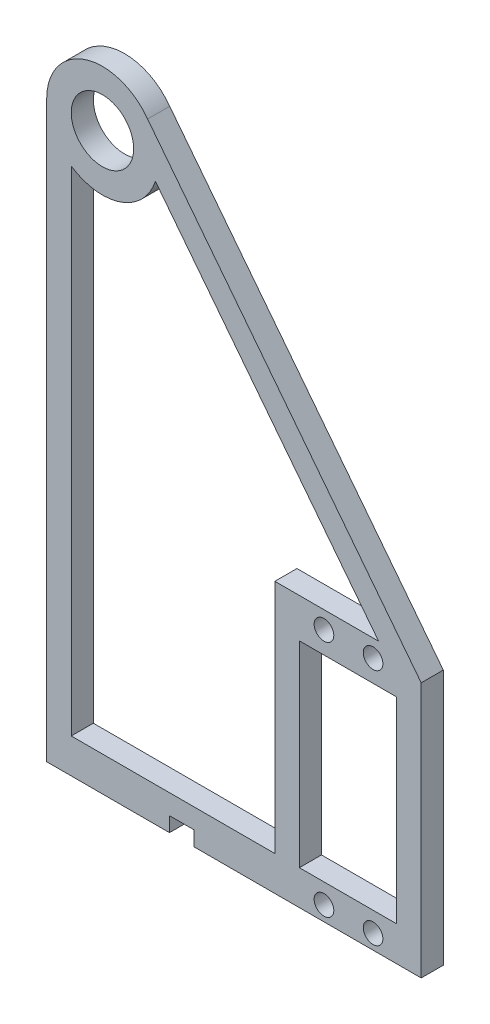
ISO-10303-21;
HEADER;
FILE_DESCRIPTION(('STEP AP214'),'2;1');
FILE_NAME('part.step','',(''),(''),'','','');
FILE_SCHEMA(('AUTOMOTIVE_DESIGN { 1 0 10303 214 1 1 1 1 }'));
ENDSEC;
DATA;
#1=APPLICATION_CONTEXT('core data for automotive mechanical design processes');
#2=APPLICATION_PROTOCOL_DEFINITION('international standard','automotive_design',2000,#1);
#3=PRODUCT_CONTEXT('',#1,'mechanical');
#4=PRODUCT('Part','Part','',(#3));
#5=PRODUCT_RELATED_PRODUCT_CATEGORY('part','',(#4));
#6=PRODUCT_DEFINITION_FORMATION('','',#4);
#7=PRODUCT_DEFINITION_CONTEXT('part definition',#1,'design');
#8=PRODUCT_DEFINITION('design','',#6,#7);
#9=PRODUCT_DEFINITION_SHAPE('','',#8);
#10=(LENGTH_UNIT() NAMED_UNIT(*) SI_UNIT(.MILLI.,.METRE.));
#11=(NAMED_UNIT(*) PLANE_ANGLE_UNIT() SI_UNIT($,.RADIAN.));
#12=(NAMED_UNIT(*) SI_UNIT($,.STERADIAN.) SOLID_ANGLE_UNIT());
#13=UNCERTAINTY_MEASURE_WITH_UNIT(LENGTH_MEASURE(1.E-05),#10,'distance_accuracy_value','');
#14=(GEOMETRIC_REPRESENTATION_CONTEXT(3) GLOBAL_UNCERTAINTY_ASSIGNED_CONTEXT((#13)) GLOBAL_UNIT_ASSIGNED_CONTEXT((#10,
#11,#12)) REPRESENTATION_CONTEXT('',''));
#15=CARTESIAN_POINT('',(0.,0.,0.));
#16=DIRECTION('',(0.,0.,1.));
#17=DIRECTION('',(1.,0.,0.));
#18=AXIS2_PLACEMENT_3D('',#15,#16,#17);
#19=CARTESIAN_POINT('',(0.,-116.95,4.5));
#20=DIRECTION('',(0.,1.,0.));
#21=DIRECTION('',(0.,0.,1.));
#22=AXIS2_PLACEMENT_3D('',#19,#20,#21);
#23=PLANE('',#22);
#24=DIRECTION('',(1.,0.,0.));
#25=VECTOR('',#24,1.);
#26=CARTESIAN_POINT('',(0.,-116.95,0.));
#27=LINE('',#26,#25);
#28=CARTESIAN_POINT('',(-11.35,-116.95,0.));
#29=VERTEX_POINT('',#28);
#30=CARTESIAN_POINT('',(13.65,-116.95,0.));
#31=VERTEX_POINT('',#30);
#32=EDGE_CURVE('E267',#29,#31,#27,.T.);
#33=ORIENTED_EDGE('',*,*,#32,.T.);
#34=DIRECTION('',(0.,0.,1.));
#35=VECTOR('',#34,1.);
#36=CARTESIAN_POINT('',(13.65,-116.95,0.));
#37=LINE('',#36,#35);
#38=CARTESIAN_POINT('',(13.65,-116.95,4.5));
#39=VERTEX_POINT('',#38);
#40=EDGE_CURVE('E203',#31,#39,#37,.T.);
#41=ORIENTED_EDGE('',*,*,#40,.T.);
#42=DIRECTION('',(1.,0.,0.));
#43=VECTOR('',#42,1.);
#44=CARTESIAN_POINT('',(0.,-116.95,4.5));
#45=LINE('',#44,#43);
#46=CARTESIAN_POINT('',(-11.35,-116.95,4.5));
#47=VERTEX_POINT('',#46);
#48=EDGE_CURVE('E182',#47,#39,#45,.T.);
#49=ORIENTED_EDGE('',*,*,#48,.F.);
#50=DIRECTION('',(0.,0.,-1.));
#51=VECTOR('',#50,1.);
#52=CARTESIAN_POINT('',(-11.35,-116.95,4.5));
#53=LINE('',#52,#51);
#54=EDGE_CURVE('E191',#47,#29,#53,.T.);
#55=ORIENTED_EDGE('',*,*,#54,.T.);
#56=EDGE_LOOP('',(#33,#41,#49,#55));
#57=FACE_BOUND('',#56,.T.);
#58=ADVANCED_FACE('F47',(#57),#23,.F.);
#59=CARTESIAN_POINT('',(8.95037531260461,6.96792282137096,4.5));
#60=DIRECTION('',(-0.789073583182352,-0.614298689827484,0.));
#61=DIRECTION('',(0.614298689827484,-0.789073583182352,0.));
#62=AXIS2_PLACEMENT_3D('',#59,#60,#61);
#63=PLANE('',#62);
#64=DIRECTION('',(-0.614298689827484,0.789073583182353,0.));
#65=VECTOR('',#64,1.);
#66=CARTESIAN_POINT('',(8.95037531260461,6.96792282137096,0.));
#67=LINE('',#66,#65);
#68=CARTESIAN_POINT('',(64.9,-64.9,0.));
#69=VERTEX_POINT('',#68);
#70=CARTESIAN_POINT('',(9.19711648453544,6.65098100808344,0.));
#71=VERTEX_POINT('',#70);
#72=EDGE_CURVE('E257',#69,#71,#67,.T.);
#73=ORIENTED_EDGE('',*,*,#72,.T.);
#74=DIRECTION('',(0.,0.,-1.));
#75=VECTOR('',#74,1.);
#76=CARTESIAN_POINT('',(9.19711648453544,6.65098100808344,4.5));
#77=LINE('',#76,#75);
#78=CARTESIAN_POINT('',(9.19711648453544,6.65098100808344,4.5));
#79=VERTEX_POINT('',#78);
#80=EDGE_CURVE('E11',#79,#71,#77,.T.);
#81=ORIENTED_EDGE('',*,*,#80,.F.);
#82=DIRECTION('',(-0.614298689827484,0.789073583182353,0.));
#83=VECTOR('',#82,1.);
#84=CARTESIAN_POINT('',(8.95037531260461,6.96792282137096,4.5));
#85=LINE('',#84,#83);
#86=CARTESIAN_POINT('',(64.9,-64.9,4.5));
#87=VERTEX_POINT('',#86);
#88=EDGE_CURVE('E371',#87,#79,#85,.T.);
#89=ORIENTED_EDGE('',*,*,#88,.F.);
#90=DIRECTION('',(0.,0.,-1.));
#91=VECTOR('',#90,1.);
#92=CARTESIAN_POINT('',(64.9,-64.9,4.5));
#93=LINE('',#92,#91);
#94=EDGE_CURVE('E273',#87,#69,#93,.T.);
#95=ORIENTED_EDGE('',*,*,#94,.T.);
#96=EDGE_LOOP('',(#73,#81,#89,#95));
#97=FACE_BOUND('',#96,.T.);
#98=ADVANCED_FACE('F377',(#97),#63,.F.);
#99=CARTESIAN_POINT('',(0.,0.,4.5));
#100=DIRECTION('',(0.,0.,-1.));
#101=DIRECTION('',(-1.,0.,0.));
#102=AXIS2_PLACEMENT_3D('',#99,#100,#101);
#103=CYLINDRICAL_SURFACE('',#102,11.35);
#104=CARTESIAN_POINT('',(0.,0.,0.));
#105=DIRECTION('',(0.,0.,1.));
#106=DIRECTION('',(1.,0.,0.));
#107=AXIS2_PLACEMENT_3D('',#104,#105,#106);
#108=CIRCLE('',#107,11.35);
#109=CARTESIAN_POINT('',(-11.35,0.,0.));
#110=VERTEX_POINT('',#109);
#111=EDGE_CURVE('E261',#71,#110,#108,.T.);
#112=ORIENTED_EDGE('',*,*,#111,.T.);
#113=DIRECTION('',(0.,0.,-1.));
#114=VECTOR('',#113,1.);
#115=CARTESIAN_POINT('',(-11.35,0.,4.5));
#116=LINE('',#115,#114);
#117=CARTESIAN_POINT('',(-11.35,0.,4.5));
#118=VERTEX_POINT('',#117);
#119=EDGE_CURVE('E57',#118,#110,#116,.T.);
#120=ORIENTED_EDGE('',*,*,#119,.F.);
#121=CARTESIAN_POINT('',(0.,0.,4.5));
#122=DIRECTION('',(0.,0.,1.));
#123=DIRECTION('',(1.,0.,0.));
#124=AXIS2_PLACEMENT_3D('',#121,#122,#123);
#125=CIRCLE('',#124,11.35);
#126=EDGE_CURVE('E183',#79,#118,#125,.T.);
#127=ORIENTED_EDGE('',*,*,#126,.F.);
#128=ORIENTED_EDGE('',*,*,#80,.T.);
#129=EDGE_LOOP('',(#112,#120,#127,#128));
#130=FACE_BOUND('',#129,.T.);
#131=ADVANCED_FACE('F380',(#130),#103,.T.);
#132=CARTESIAN_POINT('',(-11.35,0.,4.5));
#133=DIRECTION('',(1.,0.,0.));
#134=DIRECTION('',(0.,0.,-1.));
#135=AXIS2_PLACEMENT_3D('',#132,#133,#134);
#136=PLANE('',#135);
#137=DIRECTION('',(0.,-1.,0.));
#138=VECTOR('',#137,1.);
#139=CARTESIAN_POINT('',(-11.35,0.,0.));
#140=LINE('',#139,#138);
#141=EDGE_CURVE('E194',#110,#29,#140,.T.);
#142=ORIENTED_EDGE('',*,*,#141,.T.);
#143=ORIENTED_EDGE('',*,*,#54,.F.);
#144=DIRECTION('',(0.,-1.,0.));
#145=VECTOR('',#144,1.);
#146=CARTESIAN_POINT('',(-11.35,0.,4.5));
#147=LINE('',#146,#145);
#148=EDGE_CURVE('E175',#118,#47,#147,.T.);
#149=ORIENTED_EDGE('',*,*,#148,.F.);
#150=ORIENTED_EDGE('',*,*,#119,.T.);
#151=EDGE_LOOP('',(#142,#143,#149,#150));
#152=FACE_BOUND('',#151,.T.);
#153=ADVANCED_FACE('F192',(#152),#136,.F.);
#154=CARTESIAN_POINT('',(18.65,-116.95,4.5));
#155=VERTEX_POINT('',#154);
#156=CARTESIAN_POINT('',(64.9,-116.95,4.5));
#157=VERTEX_POINT('',#156);
#158=EDGE_CURVE('E188',#155,#157,#45,.T.);
#159=ORIENTED_EDGE('',*,*,#158,.F.);
#160=DIRECTION('',(0.,0.,1.));
#161=VECTOR('',#160,1.);
#162=CARTESIAN_POINT('',(18.65,-116.95,0.));
#163=LINE('',#162,#161);
#164=CARTESIAN_POINT('',(18.65,-116.95,0.));
#165=VERTEX_POINT('',#164);
#166=EDGE_CURVE('E409',#165,#155,#163,.T.);
#167=ORIENTED_EDGE('',*,*,#166,.F.);
#168=CARTESIAN_POINT('',(64.9,-116.95,0.));
#169=VERTEX_POINT('',#168);
#170=EDGE_CURVE('E266',#165,#169,#27,.T.);
#171=ORIENTED_EDGE('',*,*,#170,.T.);
#172=DIRECTION('',(0.,0.,-1.));
#173=VECTOR('',#172,1.);
#174=CARTESIAN_POINT('',(64.9,-116.95,4.5));
#175=LINE('',#174,#173);
#176=EDGE_CURVE('E199',#157,#169,#175,.T.);
#177=ORIENTED_EDGE('',*,*,#176,.F.);
#178=EDGE_LOOP('',(#159,#167,#171,#177));
#179=FACE_BOUND('',#178,.T.);
#180=ADVANCED_FACE('F487',(#179),#23,.F.);
#181=CARTESIAN_POINT('',(40.1,0.,4.5));
#182=DIRECTION('',(1.,0.,0.));
#183=DIRECTION('',(0.,1.,0.));
#184=AXIS2_PLACEMENT_3D('',#181,#182,#183);
#185=PLANE('',#184);
#186=DIRECTION('',(0.,-1.,0.));
#187=VECTOR('',#186,1.);
#188=CARTESIAN_POINT('',(40.1,0.,0.));
#189=LINE('',#188,#187);
#190=CARTESIAN_POINT('',(40.1,-69.9,0.));
#191=VERTEX_POINT('',#190);
#192=CARTESIAN_POINT('',(40.1,-109.9,0.));
#193=VERTEX_POINT('',#192);
#194=EDGE_CURVE('E237',#191,#193,#189,.T.);
#195=ORIENTED_EDGE('',*,*,#194,.F.);
#196=DIRECTION('',(0.,0.,-1.));
#197=VECTOR('',#196,1.);
#198=CARTESIAN_POINT('',(40.1,-69.9,4.5));
#199=LINE('',#198,#197);
#200=CARTESIAN_POINT('',(40.1,-69.9,4.5));
#201=VERTEX_POINT('',#200);
#202=EDGE_CURVE('E276',#201,#191,#199,.T.);
#203=ORIENTED_EDGE('',*,*,#202,.F.);
#204=DIRECTION('',(0.,-1.,0.));
#205=VECTOR('',#204,1.);
#206=CARTESIAN_POINT('',(40.1,0.,4.5));
#207=LINE('',#206,#205);
#208=CARTESIAN_POINT('',(40.1,-109.9,4.5));
#209=VERTEX_POINT('',#208);
#210=EDGE_CURVE('E352',#201,#209,#207,.T.);
#211=ORIENTED_EDGE('',*,*,#210,.T.);
#212=DIRECTION('',(0.,0.,-1.));
#213=VECTOR('',#212,1.);
#214=CARTESIAN_POINT('',(40.1,-109.9,4.5));
#215=LINE('',#214,#213);
#216=EDGE_CURVE('E281',#209,#193,#215,.T.);
#217=ORIENTED_EDGE('',*,*,#216,.T.);
#218=EDGE_LOOP('',(#195,#203,#211,#217));
#219=FACE_BOUND('',#218,.T.);
#220=ADVANCED_FACE('F495',(#219),#185,.T.);
#221=CARTESIAN_POINT('',(0.,-69.9,4.5));
#222=DIRECTION('',(0.,-1.,0.));
#223=DIRECTION('',(0.,0.,-1.));
#224=AXIS2_PLACEMENT_3D('',#221,#222,#223);
#225=PLANE('',#224);
#226=DIRECTION('',(-1.,0.,0.));
#227=VECTOR('',#226,1.);
#228=CARTESIAN_POINT('',(0.,-69.9,0.));
#229=LINE('',#228,#227);
#230=CARTESIAN_POINT('',(59.9,-69.9,0.));
#231=VERTEX_POINT('',#230);
#232=EDGE_CURVE('E241',#231,#191,#229,.T.);
#233=ORIENTED_EDGE('',*,*,#232,.F.);
#234=DIRECTION('',(0.,0.,-1.));
#235=VECTOR('',#234,1.);
#236=CARTESIAN_POINT('',(59.9,-69.9,4.5));
#237=LINE('',#236,#235);
#238=CARTESIAN_POINT('',(59.9,-69.9,4.5));
#239=VERTEX_POINT('',#238);
#240=EDGE_CURVE('E288',#239,#231,#237,.T.);
#241=ORIENTED_EDGE('',*,*,#240,.F.);
#242=DIRECTION('',(-1.,0.,0.));
#243=VECTOR('',#242,1.);
#244=CARTESIAN_POINT('',(0.,-69.9,4.5));
#245=LINE('',#244,#243);
#246=EDGE_CURVE('E356',#239,#201,#245,.T.);
#247=ORIENTED_EDGE('',*,*,#246,.T.);
#248=ORIENTED_EDGE('',*,*,#202,.T.);
#249=EDGE_LOOP('',(#233,#241,#247,#248));
#250=FACE_BOUND('',#249,.T.);
#251=ADVANCED_FACE('F501',(#250),#225,.T.);
#252=CARTESIAN_POINT('',(59.9,0.,4.5));
#253=DIRECTION('',(1.,0.,0.));
#254=DIRECTION('',(0.,0.,-1.));
#255=AXIS2_PLACEMENT_3D('',#252,#253,#254);
#256=PLANE('',#255);
#257=DIRECTION('',(0.,-1.,0.));
#258=VECTOR('',#257,1.);
#259=CARTESIAN_POINT('',(59.9,0.,0.));
#260=LINE('',#259,#258);
#261=CARTESIAN_POINT('',(59.9,-109.9,0.));
#262=VERTEX_POINT('',#261);
#263=EDGE_CURVE('E245',#231,#262,#260,.T.);
#264=ORIENTED_EDGE('',*,*,#263,.T.);
#265=DIRECTION('',(0.,0.,-1.));
#266=VECTOR('',#265,1.);
#267=CARTESIAN_POINT('',(59.9,-109.9,4.5));
#268=LINE('',#267,#266);
#269=CARTESIAN_POINT('',(59.9,-109.9,4.5));
#270=VERTEX_POINT('',#269);
#271=EDGE_CURVE('E284',#270,#262,#268,.T.);
#272=ORIENTED_EDGE('',*,*,#271,.F.);
#273=DIRECTION('',(0.,-1.,0.));
#274=VECTOR('',#273,1.);
#275=CARTESIAN_POINT('',(59.9,0.,4.5));
#276=LINE('',#275,#274);
#277=EDGE_CURVE('E360',#239,#270,#276,.T.);
#278=ORIENTED_EDGE('',*,*,#277,.F.);
#279=ORIENTED_EDGE('',*,*,#240,.T.);
#280=EDGE_LOOP('',(#264,#272,#278,#279));
#281=FACE_BOUND('',#280,.T.);
#282=ADVANCED_FACE('F559',(#281),#256,.F.);
#283=CARTESIAN_POINT('',(-6.35,0.,4.5));
#284=DIRECTION('',(1.,0.,0.));
#285=DIRECTION('',(0.,0.,-1.));
#286=AXIS2_PLACEMENT_3D('',#283,#284,#285);
#287=PLANE('',#286);
#288=DIRECTION('',(0.,-1.,0.));
#289=VECTOR('',#288,1.);
#290=CARTESIAN_POINT('',(-6.35,0.,0.));
#291=LINE('',#290,#289);
#292=CARTESIAN_POINT('',(-6.35,-9.40744386111339,0.));
#293=VERTEX_POINT('',#292);
#294=CARTESIAN_POINT('',(-6.35,-109.9,0.));
#295=VERTEX_POINT('',#294);
#296=EDGE_CURVE('E212',#293,#295,#291,.T.);
#297=ORIENTED_EDGE('',*,*,#296,.F.);
#298=DIRECTION('',(0.,0.,-1.));
#299=VECTOR('',#298,1.);
#300=CARTESIAN_POINT('',(-6.35,-9.40744386111339,4.5));
#301=LINE('',#300,#299);
#302=CARTESIAN_POINT('',(-6.35,-9.40744386111339,4.5));
#303=VERTEX_POINT('',#302);
#304=EDGE_CURVE('E51',#303,#293,#301,.T.);
#305=ORIENTED_EDGE('',*,*,#304,.F.);
#306=DIRECTION('',(0.,-1.,0.));
#307=VECTOR('',#306,1.);
#308=CARTESIAN_POINT('',(-6.35,0.,4.5));
#309=LINE('',#308,#307);
#310=CARTESIAN_POINT('',(-6.35,-109.9,4.5));
#311=VERTEX_POINT('',#310);
#312=EDGE_CURVE('E272',#303,#311,#309,.T.);
#313=ORIENTED_EDGE('',*,*,#312,.T.);
#314=DIRECTION('',(0.,0.,-1.));
#315=VECTOR('',#314,1.);
#316=CARTESIAN_POINT('',(-6.35,-109.9,4.5));
#317=LINE('',#316,#315);
#318=EDGE_CURVE('E208',#311,#295,#317,.T.);
#319=ORIENTED_EDGE('',*,*,#318,.T.);
#320=EDGE_LOOP('',(#297,#305,#313,#319));
#321=FACE_BOUND('',#320,.T.);
#322=ADVANCED_FACE('F49',(#321),#287,.T.);
#323=CARTESIAN_POINT('',(0.,0.,4.5));
#324=DIRECTION('',(0.,0.,-1.));
#325=DIRECTION('',(-1.,0.,0.));
#326=AXIS2_PLACEMENT_3D('',#323,#324,#325);
#327=CYLINDRICAL_SURFACE('',#326,11.35);
#328=CARTESIAN_POINT('',(0.,0.,0.));
#329=DIRECTION('',(0.,0.,1.));
#330=DIRECTION('',(1.,0.,0.));
#331=AXIS2_PLACEMENT_3D('',#328,#329,#330);
#332=CIRCLE('',#331,11.35);
#333=CARTESIAN_POINT('',(10.7869333558957,-3.53051961833734,0.));
#334=VERTEX_POINT('',#333);
#335=EDGE_CURVE('E216',#293,#334,#332,.T.);
#336=ORIENTED_EDGE('',*,*,#335,.T.);
#337=DIRECTION('',(0.,0.,-1.));
#338=VECTOR('',#337,1.);
#339=CARTESIAN_POINT('',(10.7869333558957,-3.53051961833734,4.5));
#340=LINE('',#339,#338);
#341=CARTESIAN_POINT('',(10.7869333558957,-3.53051961833734,4.5));
#342=VERTEX_POINT('',#341);
#343=EDGE_CURVE('E303',#342,#334,#340,.T.);
#344=ORIENTED_EDGE('',*,*,#343,.F.);
#345=CARTESIAN_POINT('',(0.,0.,4.5));
#346=DIRECTION('',(0.,0.,1.));
#347=DIRECTION('',(1.,0.,0.));
#348=AXIS2_PLACEMENT_3D('',#345,#346,#347);
#349=CIRCLE('',#348,11.35);
#350=EDGE_CURVE('E313',#303,#342,#349,.T.);
#351=ORIENTED_EDGE('',*,*,#350,.F.);
#352=ORIENTED_EDGE('',*,*,#304,.T.);
#353=EDGE_LOOP('',(#336,#344,#351,#352));
#354=FACE_BOUND('',#353,.T.);
#355=ADVANCED_FACE('F312',(#354),#327,.T.);
#356=CARTESIAN_POINT('',(5.00500739669286,3.89642937223355,4.5));
#357=DIRECTION('',(-0.789073583182352,-0.614298689827484,0.));
#358=DIRECTION('',(0.614298689827484,-0.789073583182352,0.));
#359=AXIS2_PLACEMENT_3D('',#356,#357,#358);
#360=PLANE('',#359);
#361=DIRECTION('',(-0.614298689827484,0.789073583182352,0.));
#362=VECTOR('',#361,1.);
#363=CARTESIAN_POINT('',(5.00500739669286,3.89642937223355,0.));
#364=LINE('',#363,#362);
#365=CARTESIAN_POINT('',(56.2279366901565,-61.9,0.));
#366=VERTEX_POINT('',#365);
#367=EDGE_CURVE('E221',#366,#334,#364,.T.);
#368=ORIENTED_EDGE('',*,*,#367,.F.);
#369=DIRECTION('',(0.,0.,-1.));
#370=VECTOR('',#369,1.);
#371=CARTESIAN_POINT('',(56.2279366901565,-61.9,4.5));
#372=LINE('',#371,#370);
#373=CARTESIAN_POINT('',(56.2279366901565,-61.9,4.5));
#374=VERTEX_POINT('',#373);
#375=EDGE_CURVE('E301',#374,#366,#372,.T.);
#376=ORIENTED_EDGE('',*,*,#375,.F.);
#377=DIRECTION('',(-0.614298689827484,0.789073583182352,0.));
#378=VECTOR('',#377,1.);
#379=CARTESIAN_POINT('',(5.00500739669286,3.89642937223355,4.5));
#380=LINE('',#379,#378);
#381=EDGE_CURVE('E338',#374,#342,#380,.T.);
#382=ORIENTED_EDGE('',*,*,#381,.T.);
#383=ORIENTED_EDGE('',*,*,#343,.T.);
#384=EDGE_LOOP('',(#368,#376,#382,#383));
#385=FACE_BOUND('',#384,.T.);
#386=ADVANCED_FACE('F337',(#385),#360,.T.);
#387=CARTESIAN_POINT('',(0.,-61.9,4.5));
#388=DIRECTION('',(0.,-1.,0.));
#389=DIRECTION('',(0.,0.,-1.));
#390=AXIS2_PLACEMENT_3D('',#387,#388,#389);
#391=PLANE('',#390);
#392=DIRECTION('',(-1.,0.,0.));
#393=VECTOR('',#392,1.);
#394=CARTESIAN_POINT('',(0.,-61.9,0.));
#395=LINE('',#394,#393);
#396=CARTESIAN_POINT('',(35.1,-61.9,0.));
#397=VERTEX_POINT('',#396);
#398=EDGE_CURVE('E225',#366,#397,#395,.T.);
#399=ORIENTED_EDGE('',*,*,#398,.T.);
#400=DIRECTION('',(0.,0.,-1.));
#401=VECTOR('',#400,1.);
#402=CARTESIAN_POINT('',(35.1,-61.9,4.5));
#403=LINE('',#402,#401);
#404=CARTESIAN_POINT('',(35.1,-61.9,4.5));
#405=VERTEX_POINT('',#404);
#406=EDGE_CURVE('E298',#405,#397,#403,.T.);
#407=ORIENTED_EDGE('',*,*,#406,.F.);
#408=DIRECTION('',(-1.,0.,0.));
#409=VECTOR('',#408,1.);
#410=CARTESIAN_POINT('',(0.,-61.9,4.5));
#411=LINE('',#410,#409);
#412=EDGE_CURVE('E335',#374,#405,#411,.T.);
#413=ORIENTED_EDGE('',*,*,#412,.F.);
#414=ORIENTED_EDGE('',*,*,#375,.T.);
#415=EDGE_LOOP('',(#399,#407,#413,#414));
#416=FACE_BOUND('',#415,.T.);
#417=ADVANCED_FACE('F334',(#416),#391,.F.);
#418=CARTESIAN_POINT('',(35.0999999999999,0.,4.5));
#419=DIRECTION('',(-1.,0.,0.));
#420=DIRECTION('',(0.,-1.,0.));
#421=AXIS2_PLACEMENT_3D('',#418,#419,#420);
#422=PLANE('',#421);
#423=DIRECTION('',(0.,1.,0.));
#424=VECTOR('',#423,1.);
#425=CARTESIAN_POINT('',(35.0999999999999,0.,0.));
#426=LINE('',#425,#424);
#427=CARTESIAN_POINT('',(35.1,-109.9,0.));
#428=VERTEX_POINT('',#427);
#429=EDGE_CURVE('E229',#428,#397,#426,.T.);
#430=ORIENTED_EDGE('',*,*,#429,.F.);
#431=DIRECTION('',(0.,0.,-1.));
#432=VECTOR('',#431,1.);
#433=CARTESIAN_POINT('',(35.1,-109.9,4.5));
#434=LINE('',#433,#432);
#435=CARTESIAN_POINT('',(35.1,-109.9,4.5));
#436=VERTEX_POINT('',#435);
#437=EDGE_CURVE('E295',#436,#428,#434,.T.);
#438=ORIENTED_EDGE('',*,*,#437,.F.);
#439=DIRECTION('',(0.,1.,0.));
#440=VECTOR('',#439,1.);
#441=CARTESIAN_POINT('',(35.0999999999999,0.,4.5));
#442=LINE('',#441,#440);
#443=EDGE_CURVE('E331',#436,#405,#442,.T.);
#444=ORIENTED_EDGE('',*,*,#443,.T.);
#445=ORIENTED_EDGE('',*,*,#406,.T.);
#446=EDGE_LOOP('',(#430,#438,#444,#445));
#447=FACE_BOUND('',#446,.T.);
#448=ADVANCED_FACE('F327',(#447),#422,.T.);
#449=CARTESIAN_POINT('',(0.,0.,4.5));
#450=DIRECTION('',(0.,0.,-1.));
#451=DIRECTION('',(-1.,0.,0.));
#452=AXIS2_PLACEMENT_3D('',#449,#450,#451);
#453=CYLINDRICAL_SURFACE('',#452,6.35);
#454=CARTESIAN_POINT('',(0.,0.,4.5));
#455=DIRECTION('',(0.,0.,1.));
#456=DIRECTION('',(1.,0.,0.));
#457=AXIS2_PLACEMENT_3D('',#454,#455,#456);
#458=CIRCLE('',#457,6.35);
#459=CARTESIAN_POINT('',(6.35,0.,4.5));
#460=VERTEX_POINT('',#459);
#461=EDGE_CURVE('E367',#460,#460,#458,.T.);
#462=ORIENTED_EDGE('',*,*,#461,.T.);
#463=EDGE_LOOP('',(#462));
#464=FACE_BOUND('',#463,.T.);
#465=CARTESIAN_POINT('',(0.,0.,0.));
#466=DIRECTION('',(0.,0.,1.));
#467=DIRECTION('',(1.,0.,0.));
#468=AXIS2_PLACEMENT_3D('',#465,#466,#467);
#469=CIRCLE('',#468,6.35);
#470=CARTESIAN_POINT('',(6.35,0.,0.));
#471=VERTEX_POINT('',#470);
#472=EDGE_CURVE('E253',#471,#471,#469,.T.);
#473=ORIENTED_EDGE('',*,*,#472,.F.);
#474=EDGE_LOOP('',(#473));
#475=FACE_BOUND('',#474,.T.);
#476=ADVANCED_FACE('F544',(#464,#475),#453,.F.);
#477=CARTESIAN_POINT('',(0.,-109.9,4.5));
#478=DIRECTION('',(0.,-1.,0.));
#479=DIRECTION('',(0.,0.,-1.));
#480=AXIS2_PLACEMENT_3D('',#477,#478,#479);
#481=PLANE('',#480);
#482=DIRECTION('',(-1.,0.,0.));
#483=VECTOR('',#482,1.);
#484=CARTESIAN_POINT('',(0.,-109.9,0.));
#485=LINE('',#484,#483);
#486=EDGE_CURVE('E249',#262,#193,#485,.T.);
#487=ORIENTED_EDGE('',*,*,#486,.T.);
#488=ORIENTED_EDGE('',*,*,#216,.F.);
#489=DIRECTION('',(-1.,0.,0.));
#490=VECTOR('',#489,1.);
#491=CARTESIAN_POINT('',(0.,-109.9,4.5));
#492=LINE('',#491,#490);
#493=EDGE_CURVE('E364',#270,#209,#492,.T.);
#494=ORIENTED_EDGE('',*,*,#493,.F.);
#495=ORIENTED_EDGE('',*,*,#271,.T.);
#496=EDGE_LOOP('',(#487,#488,#494,#495));
#497=FACE_BOUND('',#496,.T.);
#498=ADVANCED_FACE('F513',(#497),#481,.F.);
#499=CARTESIAN_POINT('',(0.,-109.9,4.5));
#500=DIRECTION('',(0.,1.,0.));
#501=DIRECTION('',(-1.,0.,0.));
#502=AXIS2_PLACEMENT_3D('',#499,#500,#501);
#503=PLANE('',#502);
#504=DIRECTION('',(1.,0.,0.));
#505=VECTOR('',#504,1.);
#506=CARTESIAN_POINT('',(0.,-109.9,0.));
#507=LINE('',#506,#505);
#508=EDGE_CURVE('E233',#295,#428,#507,.T.);
#509=ORIENTED_EDGE('',*,*,#508,.F.);
#510=ORIENTED_EDGE('',*,*,#318,.F.);
#511=DIRECTION('',(1.,0.,0.));
#512=VECTOR('',#511,1.);
#513=CARTESIAN_POINT('',(0.,-109.9,4.5));
#514=LINE('',#513,#512);
#515=EDGE_CURVE('E324',#311,#436,#514,.T.);
#516=ORIENTED_EDGE('',*,*,#515,.T.);
#517=ORIENTED_EDGE('',*,*,#437,.T.);
#518=EDGE_LOOP('',(#509,#510,#516,#517));
#519=FACE_BOUND('',#518,.T.);
#520=ADVANCED_FACE('F323',(#519),#503,.T.);
#521=CARTESIAN_POINT('',(64.8999999999992,4.39350453037634E-13,4.5));
#522=DIRECTION('',(-1.,0.,0.));
#523=DIRECTION('',(0.,-1.,0.));
#524=AXIS2_PLACEMENT_3D('',#521,#522,#523);
#525=PLANE('',#524);
#526=DIRECTION('',(0.,1.,0.));
#527=VECTOR('',#526,1.);
#528=CARTESIAN_POINT('',(64.8999999999992,4.39350453037634E-13,0.));
#529=LINE('',#528,#527);
#530=EDGE_CURVE('E128',#169,#69,#529,.T.);
#531=ORIENTED_EDGE('',*,*,#530,.T.);
#532=ORIENTED_EDGE('',*,*,#94,.F.);
#533=DIRECTION('',(0.,1.,0.));
#534=VECTOR('',#533,1.);
#535=CARTESIAN_POINT('',(64.8999999999992,4.39350453037634E-13,4.5));
#536=LINE('',#535,#534);
#537=EDGE_CURVE('E74',#157,#87,#536,.T.);
#538=ORIENTED_EDGE('',*,*,#537,.F.);
#539=ORIENTED_EDGE('',*,*,#176,.T.);
#540=EDGE_LOOP('',(#531,#532,#538,#539));
#541=FACE_BOUND('',#540,.T.);
#542=ADVANCED_FACE('F506',(#541),#525,.F.);
#543=CARTESIAN_POINT('',(0.,0.,4.5));
#544=DIRECTION('',(0.,0.,1.));
#545=DIRECTION('',(1.,0.,0.));
#546=AXIS2_PLACEMENT_3D('',#543,#544,#545);
#547=PLANE('',#546);
#548=DIRECTION('',(0.,-1.,0.));
#549=VECTOR('',#548,1.);
#550=CARTESIAN_POINT('',(13.65,-116.95,4.5));
#551=LINE('',#550,#549);
#552=CARTESIAN_POINT('',(13.65,-113.95,4.5));
#553=VERTEX_POINT('',#552);
#554=EDGE_CURVE('E417',#553,#39,#551,.T.);
#555=ORIENTED_EDGE('',*,*,#554,.F.);
#556=DIRECTION('',(-1.,0.,0.));
#557=VECTOR('',#556,1.);
#558=CARTESIAN_POINT('',(13.65,-113.95,4.5));
#559=LINE('',#558,#557);
#560=CARTESIAN_POINT('',(18.65,-113.95,4.5));
#561=VERTEX_POINT('',#560);
#562=EDGE_CURVE('E404',#561,#553,#559,.T.);
#563=ORIENTED_EDGE('',*,*,#562,.F.);
#564=DIRECTION('',(0.,1.,0.));
#565=VECTOR('',#564,1.);
#566=CARTESIAN_POINT('',(18.65,-116.95,4.5));
#567=LINE('',#566,#565);
#568=EDGE_CURVE('E412',#155,#561,#567,.T.);
#569=ORIENTED_EDGE('',*,*,#568,.F.);
#570=ORIENTED_EDGE('',*,*,#158,.T.);
#571=ORIENTED_EDGE('',*,*,#537,.T.);
#572=ORIENTED_EDGE('',*,*,#88,.T.);
#573=ORIENTED_EDGE('',*,*,#126,.T.);
#574=ORIENTED_EDGE('',*,*,#148,.T.);
#575=ORIENTED_EDGE('',*,*,#48,.T.);
#576=EDGE_LOOP('',(#555,#563,#569,#570,#571,#572,#573,#574,#575));
#577=FACE_BOUND('',#576,.T.);
#578=CARTESIAN_POINT('',(55.1,-65.45,4.5));
#579=DIRECTION('',(0.,0.,-1.));
#580=DIRECTION('',(-1.,0.,0.));
#581=AXIS2_PLACEMENT_3D('',#578,#579,#580);
#582=CIRCLE('',#581,2.);
#583=CARTESIAN_POINT('',(53.1,-65.45,4.5));
#584=VERTEX_POINT('',#583);
#585=EDGE_CURVE('E427',#584,#584,#582,.T.);
#586=ORIENTED_EDGE('',*,*,#585,.T.);
#587=EDGE_LOOP('',(#586));
#588=FACE_BOUND('',#587,.T.);
#589=CARTESIAN_POINT('',(45.1,-65.45,4.5));
#590=DIRECTION('',(0.,0.,-1.));
#591=DIRECTION('',(-1.,0.,0.));
#592=AXIS2_PLACEMENT_3D('',#589,#590,#591);
#593=CIRCLE('',#592,2.);
#594=CARTESIAN_POINT('',(43.1,-65.45,4.5));
#595=VERTEX_POINT('',#594);
#596=EDGE_CURVE('E446',#595,#595,#593,.T.);
#597=ORIENTED_EDGE('',*,*,#596,.T.);
#598=EDGE_LOOP('',(#597));
#599=FACE_BOUND('',#598,.T.);
#600=CARTESIAN_POINT('',(45.1,-113.95,4.5));
#601=DIRECTION('',(0.,0.,-1.));
#602=DIRECTION('',(-1.,0.,0.));
#603=AXIS2_PLACEMENT_3D('',#600,#601,#602);
#604=CIRCLE('',#603,2.);
#605=CARTESIAN_POINT('',(43.1,-113.95,4.5));
#606=VERTEX_POINT('',#605);
#607=EDGE_CURVE('E438',#606,#606,#604,.T.);
#608=ORIENTED_EDGE('',*,*,#607,.T.);
#609=EDGE_LOOP('',(#608));
#610=FACE_BOUND('',#609,.T.);
#611=CARTESIAN_POINT('',(55.1,-113.95,4.5));
#612=DIRECTION('',(0.,0.,-1.));
#613=DIRECTION('',(-1.,0.,0.));
#614=AXIS2_PLACEMENT_3D('',#611,#612,#613);
#615=CIRCLE('',#614,2.);
#616=CARTESIAN_POINT('',(53.1,-113.95,4.5));
#617=VERTEX_POINT('',#616);
#618=EDGE_CURVE('E217',#617,#617,#615,.T.);
#619=ORIENTED_EDGE('',*,*,#618,.T.);
#620=EDGE_LOOP('',(#619));
#621=FACE_BOUND('',#620,.T.);
#622=ORIENTED_EDGE('',*,*,#312,.F.);
#623=ORIENTED_EDGE('',*,*,#350,.T.);
#624=ORIENTED_EDGE('',*,*,#381,.F.);
#625=ORIENTED_EDGE('',*,*,#412,.T.);
#626=ORIENTED_EDGE('',*,*,#443,.F.);
#627=ORIENTED_EDGE('',*,*,#515,.F.);
#628=EDGE_LOOP('',(#622,#623,#624,#625,#626,#627));
#629=FACE_BOUND('',#628,.T.);
#630=ORIENTED_EDGE('',*,*,#210,.F.);
#631=ORIENTED_EDGE('',*,*,#246,.F.);
#632=ORIENTED_EDGE('',*,*,#277,.T.);
#633=ORIENTED_EDGE('',*,*,#493,.T.);
#634=EDGE_LOOP('',(#630,#631,#632,#633));
#635=FACE_BOUND('',#634,.T.);
#636=ORIENTED_EDGE('',*,*,#461,.F.);
#637=EDGE_LOOP('',(#636));
#638=FACE_BOUND('',#637,.T.);
#639=ADVANCED_FACE('F178',(#577,#588,#599,#610,#621,#629,#635,#638),#547,.T.);
#640=CARTESIAN_POINT('',(0.,0.,0.));
#641=DIRECTION('',(0.,0.,1.));
#642=DIRECTION('',(1.,0.,0.));
#643=AXIS2_PLACEMENT_3D('',#640,#641,#642);
#644=PLANE('',#643);
#645=CARTESIAN_POINT('',(55.1,-65.45,0.));
#646=DIRECTION('',(0.,0.,-1.));
#647=DIRECTION('',(-1.,0.,0.));
#648=AXIS2_PLACEMENT_3D('',#645,#646,#647);
#649=CIRCLE('',#648,2.);
#650=CARTESIAN_POINT('',(53.1,-65.45,0.));
#651=VERTEX_POINT('',#650);
#652=EDGE_CURVE('E450',#651,#651,#649,.T.);
#653=ORIENTED_EDGE('',*,*,#652,.F.);
#654=EDGE_LOOP('',(#653));
#655=FACE_BOUND('',#654,.T.);
#656=CARTESIAN_POINT('',(45.1,-65.45,0.));
#657=DIRECTION('',(0.,0.,-1.));
#658=DIRECTION('',(-1.,0.,0.));
#659=AXIS2_PLACEMENT_3D('',#656,#657,#658);
#660=CIRCLE('',#659,2.);
#661=CARTESIAN_POINT('',(43.1,-65.45,0.));
#662=VERTEX_POINT('',#661);
#663=EDGE_CURVE('E442',#662,#662,#660,.T.);
#664=ORIENTED_EDGE('',*,*,#663,.F.);
#665=EDGE_LOOP('',(#664));
#666=FACE_BOUND('',#665,.T.);
#667=CARTESIAN_POINT('',(45.1,-113.95,0.));
#668=DIRECTION('',(0.,0.,-1.));
#669=DIRECTION('',(-1.,0.,0.));
#670=AXIS2_PLACEMENT_3D('',#667,#668,#669);
#671=CIRCLE('',#670,2.);
#672=CARTESIAN_POINT('',(43.1,-113.95,0.));
#673=VERTEX_POINT('',#672);
#674=EDGE_CURVE('E433',#673,#673,#671,.T.);
#675=ORIENTED_EDGE('',*,*,#674,.F.);
#676=EDGE_LOOP('',(#675));
#677=FACE_BOUND('',#676,.T.);
#678=CARTESIAN_POINT('',(55.1,-113.95,0.));
#679=DIRECTION('',(0.,0.,-1.));
#680=DIRECTION('',(-1.,0.,0.));
#681=AXIS2_PLACEMENT_3D('',#678,#679,#680);
#682=CIRCLE('',#681,2.);
#683=CARTESIAN_POINT('',(53.1,-113.95,0.));
#684=VERTEX_POINT('',#683);
#685=EDGE_CURVE('E437',#684,#684,#682,.T.);
#686=ORIENTED_EDGE('',*,*,#685,.F.);
#687=EDGE_LOOP('',(#686));
#688=FACE_BOUND('',#687,.T.);
#689=ORIENTED_EDGE('',*,*,#296,.T.);
#690=ORIENTED_EDGE('',*,*,#508,.T.);
#691=ORIENTED_EDGE('',*,*,#429,.T.);
#692=ORIENTED_EDGE('',*,*,#398,.F.);
#693=ORIENTED_EDGE('',*,*,#367,.T.);
#694=ORIENTED_EDGE('',*,*,#335,.F.);
#695=EDGE_LOOP('',(#689,#690,#691,#692,#693,#694));
#696=FACE_BOUND('',#695,.T.);
#697=ORIENTED_EDGE('',*,*,#194,.T.);
#698=ORIENTED_EDGE('',*,*,#486,.F.);
#699=ORIENTED_EDGE('',*,*,#263,.F.);
#700=ORIENTED_EDGE('',*,*,#232,.T.);
#701=EDGE_LOOP('',(#697,#698,#699,#700));
#702=FACE_BOUND('',#701,.T.);
#703=ORIENTED_EDGE('',*,*,#472,.T.);
#704=EDGE_LOOP('',(#703));
#705=FACE_BOUND('',#704,.T.);
#706=DIRECTION('',(-1.,0.,0.));
#707=VECTOR('',#706,1.);
#708=CARTESIAN_POINT('',(13.65,-113.95,0.));
#709=LINE('',#708,#707);
#710=CARTESIAN_POINT('',(18.65,-113.95,0.));
#711=VERTEX_POINT('',#710);
#712=CARTESIAN_POINT('',(13.65,-113.95,0.));
#713=VERTEX_POINT('',#712);
#714=EDGE_CURVE('E65',#711,#713,#709,.T.);
#715=ORIENTED_EDGE('',*,*,#714,.T.);
#716=DIRECTION('',(0.,-1.,0.));
#717=VECTOR('',#716,1.);
#718=CARTESIAN_POINT('',(13.65,-116.95,0.));
#719=LINE('',#718,#717);
#720=EDGE_CURVE('E385',#713,#31,#719,.T.);
#721=ORIENTED_EDGE('',*,*,#720,.T.);
#722=ORIENTED_EDGE('',*,*,#32,.F.);
#723=ORIENTED_EDGE('',*,*,#141,.F.);
#724=ORIENTED_EDGE('',*,*,#111,.F.);
#725=ORIENTED_EDGE('',*,*,#72,.F.);
#726=ORIENTED_EDGE('',*,*,#530,.F.);
#727=ORIENTED_EDGE('',*,*,#170,.F.);
#728=DIRECTION('',(0.,1.,0.));
#729=VECTOR('',#728,1.);
#730=CARTESIAN_POINT('',(18.65,-116.95,0.));
#731=LINE('',#730,#729);
#732=EDGE_CURVE('E422',#165,#711,#731,.T.);
#733=ORIENTED_EDGE('',*,*,#732,.T.);
#734=EDGE_LOOP('',(#715,#721,#722,#723,#724,#725,#726,#727,#733));
#735=FACE_BOUND('',#734,.T.);
#736=ADVANCED_FACE('F316',(#655,#666,#677,#688,#696,#702,#705,#735),#644,.F.);
#737=CARTESIAN_POINT('',(55.1,-113.95,4.5));
#738=DIRECTION('',(0.,0.,-1.));
#739=DIRECTION('',(-1.,0.,0.));
#740=AXIS2_PLACEMENT_3D('',#737,#738,#739);
#741=CYLINDRICAL_SURFACE('',#740,2.);
#742=ORIENTED_EDGE('',*,*,#618,.F.);
#743=EDGE_LOOP('',(#742));
#744=FACE_BOUND('',#743,.T.);
#745=ORIENTED_EDGE('',*,*,#685,.T.);
#746=EDGE_LOOP('',(#745));
#747=FACE_BOUND('',#746,.T.);
#748=ADVANCED_FACE('F516',(#744,#747),#741,.F.);
#749=CARTESIAN_POINT('',(45.1,-113.95,4.5));
#750=DIRECTION('',(0.,0.,-1.));
#751=DIRECTION('',(-1.,0.,0.));
#752=AXIS2_PLACEMENT_3D('',#749,#750,#751);
#753=CYLINDRICAL_SURFACE('',#752,2.);
#754=ORIENTED_EDGE('',*,*,#607,.F.);
#755=EDGE_LOOP('',(#754));
#756=FACE_BOUND('',#755,.T.);
#757=ORIENTED_EDGE('',*,*,#674,.T.);
#758=EDGE_LOOP('',(#757));
#759=FACE_BOUND('',#758,.T.);
#760=ADVANCED_FACE('F519',(#756,#759),#753,.F.);
#761=CARTESIAN_POINT('',(45.1,-65.45,4.5));
#762=DIRECTION('',(0.,0.,-1.));
#763=DIRECTION('',(-1.,0.,0.));
#764=AXIS2_PLACEMENT_3D('',#761,#762,#763);
#765=CYLINDRICAL_SURFACE('',#764,2.);
#766=ORIENTED_EDGE('',*,*,#596,.F.);
#767=EDGE_LOOP('',(#766));
#768=FACE_BOUND('',#767,.T.);
#769=ORIENTED_EDGE('',*,*,#663,.T.);
#770=EDGE_LOOP('',(#769));
#771=FACE_BOUND('',#770,.T.);
#772=ADVANCED_FACE('F480',(#768,#771),#765,.F.);
#773=CARTESIAN_POINT('',(55.1,-65.45,4.5));
#774=DIRECTION('',(0.,0.,-1.));
#775=DIRECTION('',(-1.,0.,0.));
#776=AXIS2_PLACEMENT_3D('',#773,#774,#775);
#777=CYLINDRICAL_SURFACE('',#776,2.);
#778=ORIENTED_EDGE('',*,*,#585,.F.);
#779=EDGE_LOOP('',(#778));
#780=FACE_BOUND('',#779,.T.);
#781=ORIENTED_EDGE('',*,*,#652,.T.);
#782=EDGE_LOOP('',(#781));
#783=FACE_BOUND('',#782,.T.);
#784=ADVANCED_FACE('F472',(#780,#783),#777,.F.);
#785=CARTESIAN_POINT('',(13.65,-116.95,0.));
#786=DIRECTION('',(-1.,0.,0.));
#787=DIRECTION('',(0.,0.,1.));
#788=AXIS2_PLACEMENT_3D('',#785,#786,#787);
#789=PLANE('',#788);
#790=ORIENTED_EDGE('',*,*,#554,.T.);
#791=ORIENTED_EDGE('',*,*,#40,.F.);
#792=ORIENTED_EDGE('',*,*,#720,.F.);
#793=DIRECTION('',(0.,0.,1.));
#794=VECTOR('',#793,1.);
#795=CARTESIAN_POINT('',(13.65,-113.95,0.));
#796=LINE('',#795,#794);
#797=EDGE_CURVE('E408',#713,#553,#796,.T.);
#798=ORIENTED_EDGE('',*,*,#797,.T.);
#799=EDGE_LOOP('',(#790,#791,#792,#798));
#800=FACE_BOUND('',#799,.T.);
#801=ADVANCED_FACE('F470',(#800),#789,.F.);
#802=CARTESIAN_POINT('',(13.65,-113.95,0.));
#803=DIRECTION('',(0.,1.,0.));
#804=DIRECTION('',(0.,0.,1.));
#805=AXIS2_PLACEMENT_3D('',#802,#803,#804);
#806=PLANE('',#805);
#807=ORIENTED_EDGE('',*,*,#562,.T.);
#808=ORIENTED_EDGE('',*,*,#797,.F.);
#809=ORIENTED_EDGE('',*,*,#714,.F.);
#810=DIRECTION('',(0.,0.,1.));
#811=VECTOR('',#810,1.);
#812=CARTESIAN_POINT('',(18.65,-113.95,0.));
#813=LINE('',#812,#811);
#814=EDGE_CURVE('E400',#711,#561,#813,.T.);
#815=ORIENTED_EDGE('',*,*,#814,.T.);
#816=EDGE_LOOP('',(#807,#808,#809,#815));
#817=FACE_BOUND('',#816,.T.);
#818=ADVANCED_FACE('F402',(#817),#806,.F.);
#819=CARTESIAN_POINT('',(18.65,-116.95,0.));
#820=DIRECTION('',(1.,0.,0.));
#821=DIRECTION('',(0.,0.,-1.));
#822=AXIS2_PLACEMENT_3D('',#819,#820,#821);
#823=PLANE('',#822);
#824=ORIENTED_EDGE('',*,*,#568,.T.);
#825=ORIENTED_EDGE('',*,*,#814,.F.);
#826=ORIENTED_EDGE('',*,*,#732,.F.);
#827=ORIENTED_EDGE('',*,*,#166,.T.);
#828=EDGE_LOOP('',(#824,#825,#826,#827));
#829=FACE_BOUND('',#828,.T.);
#830=ADVANCED_FACE('F413',(#829),#823,.F.);
#831=CLOSED_SHELL('',(#58,#98,#131,#153,#180,#220,#251,#282,#322,#355,#386,#417,#448,#476,#498,
#520,#542,#639,#736,#748,#760,#772,#784,#801,#818,#830));
#832=MANIFOLD_SOLID_BREP('B2',#831);
#833=ADVANCED_BREP_SHAPE_REPRESENTATION('',(#18,#832),#14);
#834=SHAPE_DEFINITION_REPRESENTATION(#9,#833);
ENDSEC;
END-ISO-10303-21;
